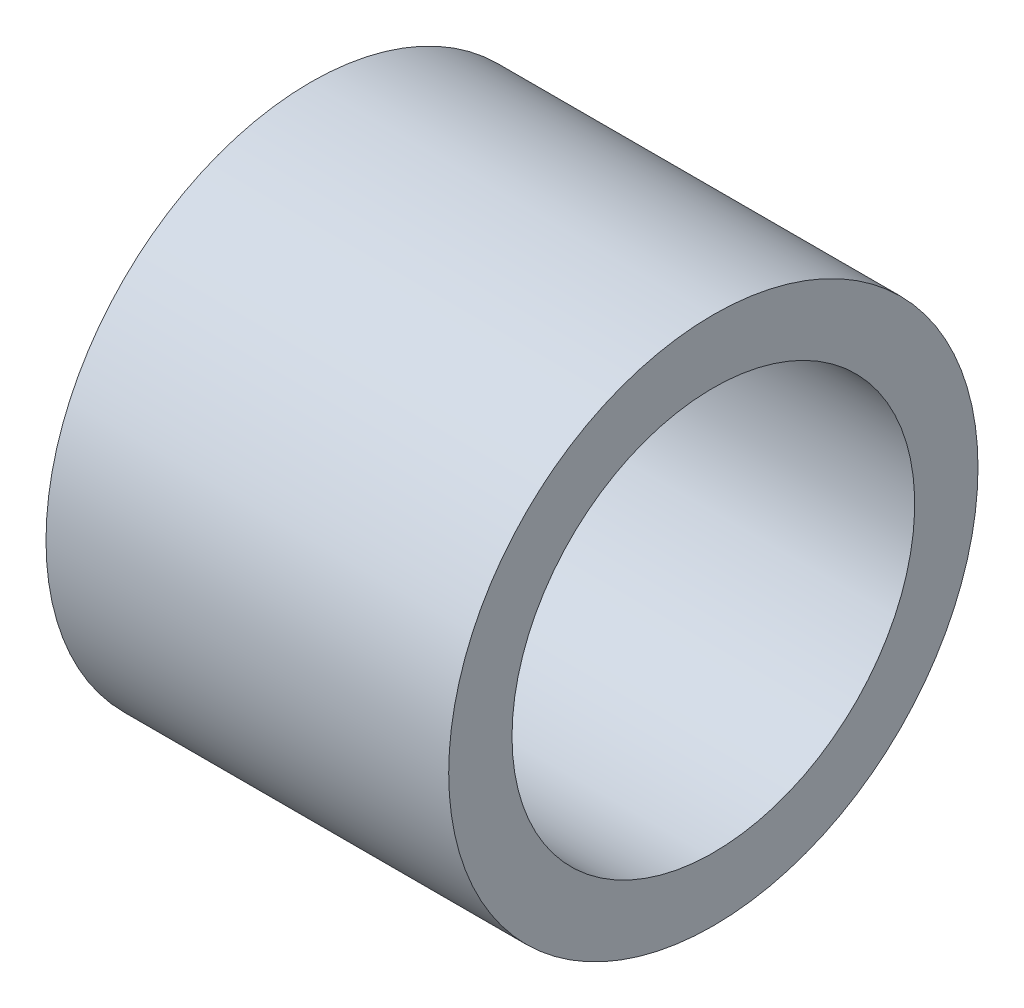
ISO-10303-21;
HEADER;
FILE_DESCRIPTION(('STEP AP214'),'2;1');
FILE_NAME('part.step','',(''),(''),'','','');
FILE_SCHEMA(('AUTOMOTIVE_DESIGN { 1 0 10303 214 1 1 1 1 }'));
ENDSEC;
DATA;
#1=APPLICATION_CONTEXT('core data for automotive mechanical design processes');
#2=APPLICATION_PROTOCOL_DEFINITION('international standard','automotive_design',2000,#1);
#3=PRODUCT_CONTEXT('',#1,'mechanical');
#4=PRODUCT('Part','Part','',(#3));
#5=PRODUCT_RELATED_PRODUCT_CATEGORY('part','',(#4));
#6=PRODUCT_DEFINITION_FORMATION('','',#4);
#7=PRODUCT_DEFINITION_CONTEXT('part definition',#1,'design');
#8=PRODUCT_DEFINITION('design','',#6,#7);
#9=PRODUCT_DEFINITION_SHAPE('','',#8);
#10=(LENGTH_UNIT() NAMED_UNIT(*) SI_UNIT(.MILLI.,.METRE.));
#11=(NAMED_UNIT(*) PLANE_ANGLE_UNIT() SI_UNIT($,.RADIAN.));
#12=(NAMED_UNIT(*) SI_UNIT($,.STERADIAN.) SOLID_ANGLE_UNIT());
#13=UNCERTAINTY_MEASURE_WITH_UNIT(LENGTH_MEASURE(1.E-05),#10,'distance_accuracy_value','');
#14=(GEOMETRIC_REPRESENTATION_CONTEXT(3) GLOBAL_UNCERTAINTY_ASSIGNED_CONTEXT((#13)) GLOBAL_UNIT_ASSIGNED_CONTEXT((#10,
#11,#12)) REPRESENTATION_CONTEXT('',''));
#15=CARTESIAN_POINT('',(0.,0.,0.));
#16=DIRECTION('',(0.,0.,1.));
#17=DIRECTION('',(1.,0.,0.));
#18=AXIS2_PLACEMENT_3D('',#15,#16,#17);
#19=CARTESIAN_POINT('',(9.525,0.,0.));
#20=DIRECTION('',(1.,0.,0.));
#21=DIRECTION('',(0.,0.,-1.));
#22=AXIS2_PLACEMENT_3D('',#19,#20,#21);
#23=PLANE('',#22);
#24=CARTESIAN_POINT('',(9.525,0.,0.));
#25=DIRECTION('',(1.,0.,0.));
#26=DIRECTION('',(0.,0.,-1.));
#27=AXIS2_PLACEMENT_3D('',#24,#25,#26);
#28=CIRCLE('',#27,12.52);
#29=CARTESIAN_POINT('',(9.525,0.,12.52));
#30=VERTEX_POINT('',#29);
#31=EDGE_CURVE('E10',#30,#30,#28,.T.);
#32=ORIENTED_EDGE('',*,*,#31,.T.);
#33=EDGE_LOOP('',(#32));
#34=FACE_BOUND('',#33,.T.);
#35=CARTESIAN_POINT('',(9.525,0.,0.));
#36=DIRECTION('',(1.,0.,0.));
#37=DIRECTION('',(0.,0.,-1.));
#38=AXIS2_PLACEMENT_3D('',#35,#36,#37);
#39=CIRCLE('',#38,9.525);
#40=CARTESIAN_POINT('',(9.525,0.,9.525));
#41=VERTEX_POINT('',#40);
#42=EDGE_CURVE('E42',#41,#41,#39,.T.);
#43=ORIENTED_EDGE('',*,*,#42,.F.);
#44=EDGE_LOOP('',(#43));
#45=FACE_BOUND('',#44,.T.);
#46=ADVANCED_FACE('F31',(#34,#45),#23,.T.);
#47=CARTESIAN_POINT('',(-9.525,0.,0.));
#48=DIRECTION('',(1.,0.,0.));
#49=DIRECTION('',(0.,0.,-1.));
#50=AXIS2_PLACEMENT_3D('',#47,#48,#49);
#51=PLANE('',#50);
#52=CARTESIAN_POINT('',(-9.525,0.,0.));
#53=DIRECTION('',(1.,0.,0.));
#54=DIRECTION('',(0.,0.,-1.));
#55=AXIS2_PLACEMENT_3D('',#52,#53,#54);
#56=CIRCLE('',#55,12.52);
#57=CARTESIAN_POINT('',(-9.525,0.,12.52));
#58=VERTEX_POINT('',#57);
#59=EDGE_CURVE('E35',#58,#58,#56,.T.);
#60=ORIENTED_EDGE('',*,*,#59,.F.);
#61=EDGE_LOOP('',(#60));
#62=FACE_BOUND('',#61,.T.);
#63=CARTESIAN_POINT('',(-9.525,0.,0.));
#64=DIRECTION('',(1.,0.,0.));
#65=DIRECTION('',(0.,0.,-1.));
#66=AXIS2_PLACEMENT_3D('',#63,#64,#65);
#67=CIRCLE('',#66,9.525);
#68=CARTESIAN_POINT('',(-9.525,0.,9.525));
#69=VERTEX_POINT('',#68);
#70=EDGE_CURVE('E44',#69,#69,#67,.T.);
#71=ORIENTED_EDGE('',*,*,#70,.T.);
#72=EDGE_LOOP('',(#71));
#73=FACE_BOUND('',#72,.T.);
#74=ADVANCED_FACE('F54',(#62,#73),#51,.F.);
#75=CARTESIAN_POINT('',(9.525,0.,0.));
#76=DIRECTION('',(-1.,0.,0.));
#77=DIRECTION('',(0.,0.,1.));
#78=AXIS2_PLACEMENT_3D('',#75,#76,#77);
#79=CYLINDRICAL_SURFACE('',#78,12.52);
#80=CARTESIAN_POINT('',(9.525,0.,12.52));
#81=CARTESIAN_POINT('',(9.3265625,0.,12.52));
#82=CARTESIAN_POINT('',(9.128125,0.,12.52));
#83=CARTESIAN_POINT('',(8.73125,0.,12.52));
#84=CARTESIAN_POINT('',(8.5328125,0.,12.52));
#85=CARTESIAN_POINT('',(8.1359375,0.,12.52));
#86=CARTESIAN_POINT('',(7.9375,0.,12.52));
#87=CARTESIAN_POINT('',(7.540625,0.,12.52));
#88=CARTESIAN_POINT('',(7.3421875,0.,12.52));
#89=CARTESIAN_POINT('',(6.9453125,0.,12.52));
#90=CARTESIAN_POINT('',(6.746875,0.,12.52));
#91=CARTESIAN_POINT('',(6.35,0.,12.52));
#92=CARTESIAN_POINT('',(6.1515625,0.,12.52));
#93=CARTESIAN_POINT('',(5.7546875,0.,12.52));
#94=CARTESIAN_POINT('',(5.55625,0.,12.52));
#95=CARTESIAN_POINT('',(5.159375,0.,12.52));
#96=CARTESIAN_POINT('',(4.9609375,0.,12.52));
#97=CARTESIAN_POINT('',(4.5640625,0.,12.52));
#98=CARTESIAN_POINT('',(4.365625,0.,12.52));
#99=CARTESIAN_POINT('',(3.96875,0.,12.52));
#100=CARTESIAN_POINT('',(3.7703125,0.,12.52));
#101=CARTESIAN_POINT('',(3.3734375,0.,12.52));
#102=CARTESIAN_POINT('',(3.175,0.,12.52));
#103=CARTESIAN_POINT('',(2.778125,0.,12.52));
#104=CARTESIAN_POINT('',(2.5796875,0.,12.52));
#105=CARTESIAN_POINT('',(2.1828125,0.,12.52));
#106=CARTESIAN_POINT('',(1.984375,0.,12.52));
#107=CARTESIAN_POINT('',(1.5875,0.,12.52));
#108=CARTESIAN_POINT('',(1.3890625,0.,12.52));
#109=CARTESIAN_POINT('',(0.992187500000001,0.,12.52));
#110=CARTESIAN_POINT('',(0.793750000000001,0.,12.52));
#111=CARTESIAN_POINT('',(0.396875,0.,12.52));
#112=CARTESIAN_POINT('',(0.1984375,0.,12.52));
#113=CARTESIAN_POINT('',(-0.1984375,0.,12.52));
#114=CARTESIAN_POINT('',(-0.396875,0.,12.52));
#115=CARTESIAN_POINT('',(-0.793750000000001,0.,12.52));
#116=CARTESIAN_POINT('',(-0.992187500000001,0.,12.52));
#117=CARTESIAN_POINT('',(-1.3890625,0.,12.52));
#118=CARTESIAN_POINT('',(-1.5875,0.,12.52));
#119=CARTESIAN_POINT('',(-1.984375,0.,12.52));
#120=CARTESIAN_POINT('',(-2.1828125,0.,12.52));
#121=CARTESIAN_POINT('',(-2.5796875,0.,12.52));
#122=CARTESIAN_POINT('',(-2.778125,0.,12.52));
#123=CARTESIAN_POINT('',(-3.175,0.,12.52));
#124=CARTESIAN_POINT('',(-3.3734375,0.,12.52));
#125=CARTESIAN_POINT('',(-3.7703125,0.,12.52));
#126=CARTESIAN_POINT('',(-3.96875,0.,12.52));
#127=CARTESIAN_POINT('',(-4.365625,0.,12.52));
#128=CARTESIAN_POINT('',(-4.5640625,0.,12.52));
#129=CARTESIAN_POINT('',(-4.9609375,0.,12.52));
#130=CARTESIAN_POINT('',(-5.159375,0.,12.52));
#131=CARTESIAN_POINT('',(-5.55625,0.,12.52));
#132=CARTESIAN_POINT('',(-5.7546875,0.,12.52));
#133=CARTESIAN_POINT('',(-6.1515625,0.,12.52));
#134=CARTESIAN_POINT('',(-6.35,0.,12.52));
#135=CARTESIAN_POINT('',(-6.746875,0.,12.52));
#136=CARTESIAN_POINT('',(-6.9453125,0.,12.52));
#137=CARTESIAN_POINT('',(-7.3421875,0.,12.52));
#138=CARTESIAN_POINT('',(-7.540625,0.,12.52));
#139=CARTESIAN_POINT('',(-7.9375,0.,12.52));
#140=CARTESIAN_POINT('',(-8.1359375,0.,12.52));
#141=CARTESIAN_POINT('',(-8.5328125,0.,12.52));
#142=CARTESIAN_POINT('',(-8.73125,0.,12.52));
#143=CARTESIAN_POINT('',(-9.128125,0.,12.52));
#144=CARTESIAN_POINT('',(-9.3265625,0.,12.52));
#145=CARTESIAN_POINT('',(-9.525,0.,12.52));
#146=B_SPLINE_CURVE_WITH_KNOTS('',3,(#80,#81,#82,#83,#84,#85,#86,#87,#88,#89,#90,#91,#92,#93,
#94,#95,#96,#97,#98,#99,#100,#101,#102,#103,#104,#105,#106,#107,#108,#109,#110,#111,#112,#113,
#114,#115,#116,#117,#118,#119,#120,#121,#122,#123,#124,#125,#126,#127,#128,#129,#130,#131,#132,
#133,#134,#135,#136,#137,#138,#139,#140,#141,#142,#143,#144,#145),.UNSPECIFIED.,.F.,.F.,(4,2,2,
2,2,2,2,2,2,2,2,2,2,2,2,2,2,2,2,2,2,2,2,2,2,2,2,2,2,2,2,2,4),(0.,0.5953125,1.190625,1.7859375,
2.38125,2.9765625,3.571875,4.1671875,4.7625,5.3578125,5.953125,6.5484375,7.14375,7.7390625,
8.334375,8.9296875,9.525,10.1203125,10.715625,11.3109375,11.90625,12.5015625,13.096875,
13.6921875,14.2875,14.8828125,15.478125,16.0734375,16.66875,17.2640625,17.859375,18.4546875,
19.05),.UNSPECIFIED.);
#147=EDGE_CURVE('BSEAM33',#30,#58,#146,.T.);
#148=ORIENTED_EDGE('',*,*,#31,.F.);
#149=ORIENTED_EDGE('',*,*,#59,.T.);
#150=ORIENTED_EDGE('',*,*,#147,.T.);
#151=ORIENTED_EDGE('',*,*,#147,.F.);
#152=EDGE_LOOP('',(#148,#150,#149,#151));
#153=FACE_BOUND('',#152,.T.);
#154=ADVANCED_FACE('F33',(#153),#79,.T.);
#155=CARTESIAN_POINT('',(9.525,0.,0.));
#156=DIRECTION('',(-1.,0.,0.));
#157=DIRECTION('',(0.,0.,1.));
#158=AXIS2_PLACEMENT_3D('',#155,#156,#157);
#159=CYLINDRICAL_SURFACE('',#158,9.525);
#160=CARTESIAN_POINT('',(9.525,0.,9.525));
#161=CARTESIAN_POINT('',(9.3265625,0.,9.525));
#162=CARTESIAN_POINT('',(9.128125,0.,9.525));
#163=CARTESIAN_POINT('',(8.73125,0.,9.525));
#164=CARTESIAN_POINT('',(8.5328125,0.,9.525));
#165=CARTESIAN_POINT('',(8.1359375,0.,9.525));
#166=CARTESIAN_POINT('',(7.9375,0.,9.525));
#167=CARTESIAN_POINT('',(7.540625,0.,9.525));
#168=CARTESIAN_POINT('',(7.3421875,0.,9.525));
#169=CARTESIAN_POINT('',(6.9453125,0.,9.525));
#170=CARTESIAN_POINT('',(6.746875,0.,9.525));
#171=CARTESIAN_POINT('',(6.35,0.,9.525));
#172=CARTESIAN_POINT('',(6.1515625,0.,9.525));
#173=CARTESIAN_POINT('',(5.7546875,0.,9.525));
#174=CARTESIAN_POINT('',(5.55625,0.,9.525));
#175=CARTESIAN_POINT('',(5.159375,0.,9.525));
#176=CARTESIAN_POINT('',(4.9609375,0.,9.525));
#177=CARTESIAN_POINT('',(4.5640625,0.,9.525));
#178=CARTESIAN_POINT('',(4.365625,0.,9.525));
#179=CARTESIAN_POINT('',(3.96875,0.,9.525));
#180=CARTESIAN_POINT('',(3.7703125,0.,9.525));
#181=CARTESIAN_POINT('',(3.3734375,0.,9.525));
#182=CARTESIAN_POINT('',(3.175,0.,9.525));
#183=CARTESIAN_POINT('',(2.778125,0.,9.525));
#184=CARTESIAN_POINT('',(2.5796875,0.,9.525));
#185=CARTESIAN_POINT('',(2.1828125,0.,9.525));
#186=CARTESIAN_POINT('',(1.984375,0.,9.525));
#187=CARTESIAN_POINT('',(1.5875,0.,9.525));
#188=CARTESIAN_POINT('',(1.3890625,0.,9.525));
#189=CARTESIAN_POINT('',(0.992187500000001,0.,9.525));
#190=CARTESIAN_POINT('',(0.793750000000001,0.,9.525));
#191=CARTESIAN_POINT('',(0.396875,0.,9.525));
#192=CARTESIAN_POINT('',(0.1984375,0.,9.525));
#193=CARTESIAN_POINT('',(-0.1984375,0.,9.525));
#194=CARTESIAN_POINT('',(-0.396875,0.,9.525));
#195=CARTESIAN_POINT('',(-0.793750000000001,0.,9.525));
#196=CARTESIAN_POINT('',(-0.992187500000001,0.,9.525));
#197=CARTESIAN_POINT('',(-1.3890625,0.,9.525));
#198=CARTESIAN_POINT('',(-1.5875,0.,9.525));
#199=CARTESIAN_POINT('',(-1.984375,0.,9.525));
#200=CARTESIAN_POINT('',(-2.1828125,0.,9.525));
#201=CARTESIAN_POINT('',(-2.5796875,0.,9.525));
#202=CARTESIAN_POINT('',(-2.778125,0.,9.525));
#203=CARTESIAN_POINT('',(-3.175,0.,9.525));
#204=CARTESIAN_POINT('',(-3.3734375,0.,9.525));
#205=CARTESIAN_POINT('',(-3.7703125,0.,9.525));
#206=CARTESIAN_POINT('',(-3.96875,0.,9.525));
#207=CARTESIAN_POINT('',(-4.365625,0.,9.525));
#208=CARTESIAN_POINT('',(-4.5640625,0.,9.525));
#209=CARTESIAN_POINT('',(-4.9609375,0.,9.525));
#210=CARTESIAN_POINT('',(-5.159375,0.,9.525));
#211=CARTESIAN_POINT('',(-5.55625,0.,9.525));
#212=CARTESIAN_POINT('',(-5.7546875,0.,9.525));
#213=CARTESIAN_POINT('',(-6.1515625,0.,9.525));
#214=CARTESIAN_POINT('',(-6.35,0.,9.525));
#215=CARTESIAN_POINT('',(-6.746875,0.,9.525));
#216=CARTESIAN_POINT('',(-6.9453125,0.,9.525));
#217=CARTESIAN_POINT('',(-7.3421875,0.,9.525));
#218=CARTESIAN_POINT('',(-7.540625,0.,9.525));
#219=CARTESIAN_POINT('',(-7.9375,0.,9.525));
#220=CARTESIAN_POINT('',(-8.1359375,0.,9.525));
#221=CARTESIAN_POINT('',(-8.5328125,0.,9.525));
#222=CARTESIAN_POINT('',(-8.73125,0.,9.525));
#223=CARTESIAN_POINT('',(-9.128125,0.,9.525));
#224=CARTESIAN_POINT('',(-9.3265625,0.,9.525));
#225=CARTESIAN_POINT('',(-9.525,0.,9.525));
#226=B_SPLINE_CURVE_WITH_KNOTS('',3,(#160,#161,#162,#163,#164,#165,#166,#167,#168,#169,#170,
#171,#172,#173,#174,#175,#176,#177,#178,#179,#180,#181,#182,#183,#184,#185,#186,#187,#188,#189,
#190,#191,#192,#193,#194,#195,#196,#197,#198,#199,#200,#201,#202,#203,#204,#205,#206,#207,#208,
#209,#210,#211,#212,#213,#214,#215,#216,#217,#218,#219,#220,#221,#222,#223,#224,#225),
.UNSPECIFIED.,.F.,.F.,(4,2,2,2,2,2,2,2,2,2,2,2,2,2,2,2,2,2,2,2,2,2,2,2,2,2,2,2,2,2,2,2,4),(0.,
0.5953125,1.190625,1.7859375,2.38125,2.9765625,3.571875,4.1671875,4.7625,5.3578125,5.953125,
6.5484375,7.14375,7.7390625,8.334375,8.9296875,9.525,10.1203125,10.715625,11.3109375,11.90625,
12.5015625,13.096875,13.6921875,14.2875,14.8828125,15.478125,16.0734375,16.66875,17.2640625,
17.859375,18.4546875,19.05),.UNSPECIFIED.);
#227=EDGE_CURVE('BSEAM50',#41,#69,#226,.T.);
#228=ORIENTED_EDGE('',*,*,#42,.T.);
#229=ORIENTED_EDGE('',*,*,#70,.F.);
#230=ORIENTED_EDGE('',*,*,#227,.T.);
#231=ORIENTED_EDGE('',*,*,#227,.F.);
#232=EDGE_LOOP('',(#228,#230,#229,#231));
#233=FACE_BOUND('',#232,.T.);
#234=ADVANCED_FACE('F50',(#233),#159,.F.);
#235=CLOSED_SHELL('',(#46,#74,#154,#234));
#236=MANIFOLD_SOLID_BREP('B2',#235);
#237=ADVANCED_BREP_SHAPE_REPRESENTATION('',(#18,#236),#14);
#238=SHAPE_DEFINITION_REPRESENTATION(#9,#237);
ENDSEC;
END-ISO-10303-21;
